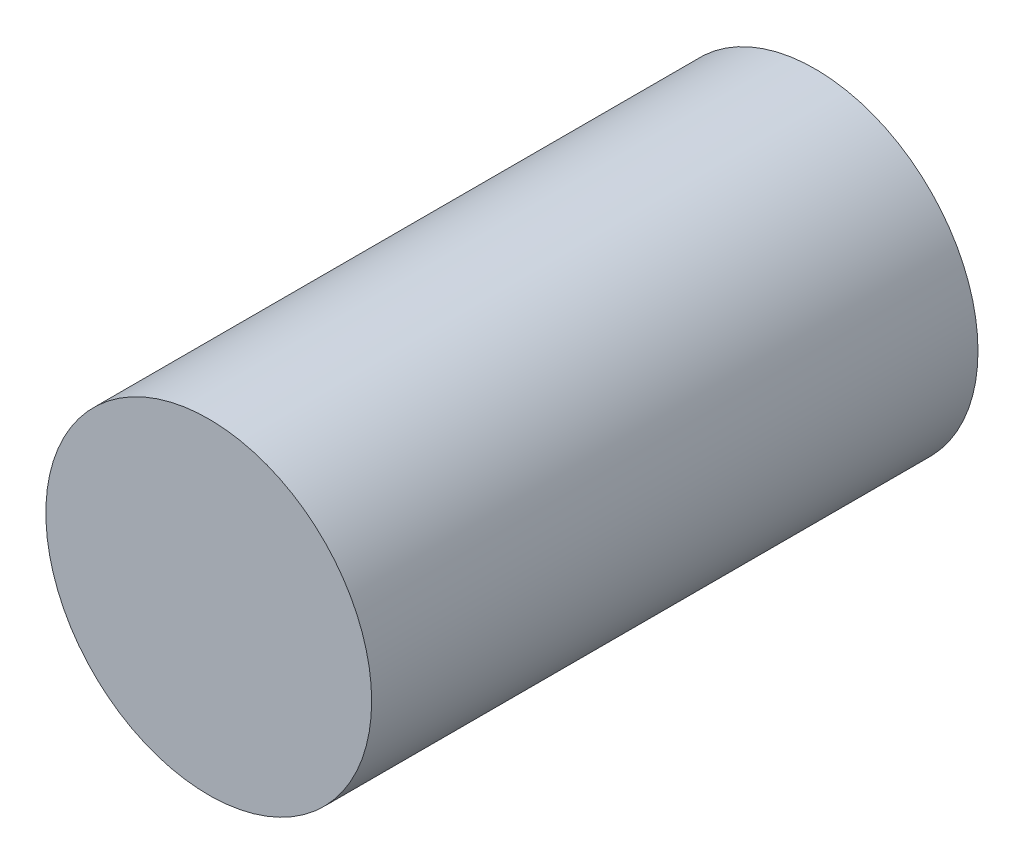
ISO-10303-21;
HEADER;
FILE_DESCRIPTION(('STEP AP214'),'2;1');
FILE_NAME('part.step','',(''),(''),'','','');
FILE_SCHEMA(('AUTOMOTIVE_DESIGN { 1 0 10303 214 1 1 1 1 }'));
ENDSEC;
DATA;
#1=APPLICATION_CONTEXT('core data for automotive mechanical design processes');
#2=APPLICATION_PROTOCOL_DEFINITION('international standard','automotive_design',2000,#1);
#3=PRODUCT_CONTEXT('',#1,'mechanical');
#4=PRODUCT('Part','Part','',(#3));
#5=PRODUCT_RELATED_PRODUCT_CATEGORY('part','',(#4));
#6=PRODUCT_DEFINITION_FORMATION('','',#4);
#7=PRODUCT_DEFINITION_CONTEXT('part definition',#1,'design');
#8=PRODUCT_DEFINITION('design','',#6,#7);
#9=PRODUCT_DEFINITION_SHAPE('','',#8);
#10=(LENGTH_UNIT() NAMED_UNIT(*) SI_UNIT(.MILLI.,.METRE.));
#11=(NAMED_UNIT(*) PLANE_ANGLE_UNIT() SI_UNIT($,.RADIAN.));
#12=(NAMED_UNIT(*) SI_UNIT($,.STERADIAN.) SOLID_ANGLE_UNIT());
#13=UNCERTAINTY_MEASURE_WITH_UNIT(LENGTH_MEASURE(1.E-05),#10,'distance_accuracy_value','');
#14=(GEOMETRIC_REPRESENTATION_CONTEXT(3) GLOBAL_UNCERTAINTY_ASSIGNED_CONTEXT((#13)) GLOBAL_UNIT_ASSIGNED_CONTEXT((#10,
#11,#12)) REPRESENTATION_CONTEXT('',''));
#15=CARTESIAN_POINT('',(0.,0.,0.));
#16=DIRECTION('',(0.,0.,1.));
#17=DIRECTION('',(1.,0.,0.));
#18=AXIS2_PLACEMENT_3D('',#15,#16,#17);
#19=CARTESIAN_POINT('',(0.,0.,67.));
#20=DIRECTION('',(0.,0.,-1.));
#21=DIRECTION('',(-1.,0.,0.));
#22=AXIS2_PLACEMENT_3D('',#19,#20,#21);
#23=CYLINDRICAL_SURFACE('',#22,18.);
#24=CARTESIAN_POINT('',(0.,0.,67.));
#25=DIRECTION('',(0.,0.,1.));
#26=DIRECTION('',(1.,0.,0.));
#27=AXIS2_PLACEMENT_3D('',#24,#25,#26);
#28=CIRCLE('',#27,18.);
#29=CARTESIAN_POINT('',(18.,0.,67.));
#30=VERTEX_POINT('',#29);
#31=EDGE_CURVE('E10',#30,#30,#28,.T.);
#32=ORIENTED_EDGE('',*,*,#31,.F.);
#33=EDGE_LOOP('',(#32));
#34=FACE_BOUND('',#33,.T.);
#35=CARTESIAN_POINT('',(0.,0.,0.));
#36=DIRECTION('',(0.,0.,1.));
#37=DIRECTION('',(1.,0.,0.));
#38=AXIS2_PLACEMENT_3D('',#35,#36,#37);
#39=CIRCLE('',#38,18.);
#40=CARTESIAN_POINT('',(18.,0.,0.));
#41=VERTEX_POINT('',#40);
#42=EDGE_CURVE('E40',#41,#41,#39,.T.);
#43=ORIENTED_EDGE('',*,*,#42,.T.);
#44=EDGE_LOOP('',(#43));
#45=FACE_BOUND('',#44,.T.);
#46=ADVANCED_FACE('F37',(#34,#45),#23,.T.);
#47=CARTESIAN_POINT('',(0.,0.,67.));
#48=DIRECTION('',(0.,0.,1.));
#49=DIRECTION('',(1.,0.,0.));
#50=AXIS2_PLACEMENT_3D('',#47,#48,#49);
#51=PLANE('',#50);
#52=ORIENTED_EDGE('',*,*,#31,.T.);
#53=EDGE_LOOP('',(#52));
#54=FACE_BOUND('',#53,.T.);
#55=ADVANCED_FACE('F52',(#54),#51,.T.);
#56=CARTESIAN_POINT('',(0.,0.,0.));
#57=DIRECTION('',(0.,0.,1.));
#58=DIRECTION('',(1.,0.,0.));
#59=AXIS2_PLACEMENT_3D('',#56,#57,#58);
#60=PLANE('',#59);
#61=ORIENTED_EDGE('',*,*,#42,.F.);
#62=EDGE_LOOP('',(#61));
#63=FACE_BOUND('',#62,.T.);
#64=ADVANCED_FACE('F50',(#63),#60,.F.);
#65=CLOSED_SHELL('',(#46,#55,#64));
#66=MANIFOLD_SOLID_BREP('B2',#65);
#67=ADVANCED_BREP_SHAPE_REPRESENTATION('',(#18,#66),#14);
#68=SHAPE_DEFINITION_REPRESENTATION(#9,#67);
ENDSEC;
END-ISO-10303-21;
